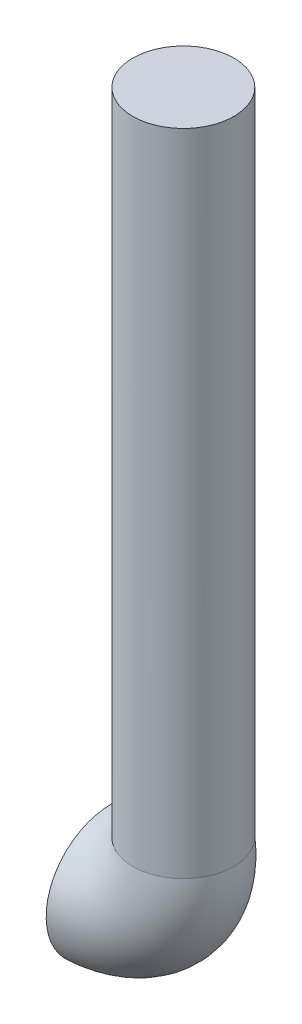
ISO-10303-21;
HEADER;
FILE_DESCRIPTION(('STEP AP214'),'2;1');
FILE_NAME('part.step','',(''),(''),'','','');
FILE_SCHEMA(('AUTOMOTIVE_DESIGN { 1 0 10303 214 1 1 1 1 }'));
ENDSEC;
DATA;
#1=APPLICATION_CONTEXT('core data for automotive mechanical design processes');
#2=APPLICATION_PROTOCOL_DEFINITION('international standard','automotive_design',2000,#1);
#3=PRODUCT_CONTEXT('',#1,'mechanical');
#4=PRODUCT('Part','Part','',(#3));
#5=PRODUCT_RELATED_PRODUCT_CATEGORY('part','',(#4));
#6=PRODUCT_DEFINITION_FORMATION('','',#4);
#7=PRODUCT_DEFINITION_CONTEXT('part definition',#1,'design');
#8=PRODUCT_DEFINITION('design','',#6,#7);
#9=PRODUCT_DEFINITION_SHAPE('','',#8);
#10=(LENGTH_UNIT() NAMED_UNIT(*) SI_UNIT(.MILLI.,.METRE.));
#11=(NAMED_UNIT(*) PLANE_ANGLE_UNIT() SI_UNIT($,.RADIAN.));
#12=(NAMED_UNIT(*) SI_UNIT($,.STERADIAN.) SOLID_ANGLE_UNIT());
#13=UNCERTAINTY_MEASURE_WITH_UNIT(LENGTH_MEASURE(1.E-05),#10,'distance_accuracy_value','');
#14=(GEOMETRIC_REPRESENTATION_CONTEXT(3) GLOBAL_UNCERTAINTY_ASSIGNED_CONTEXT((#13)) GLOBAL_UNIT_ASSIGNED_CONTEXT((#10,
#11,#12)) REPRESENTATION_CONTEXT('',''));
#15=CARTESIAN_POINT('',(0.,0.,0.));
#16=DIRECTION('',(0.,0.,1.));
#17=DIRECTION('',(1.,0.,0.));
#18=AXIS2_PLACEMENT_3D('',#15,#16,#17);
#19=CARTESIAN_POINT('',(0.,0.,0.));
#20=DIRECTION('',(1.,0.,0.));
#21=DIRECTION('',(0.,0.,-1.));
#22=AXIS2_PLACEMENT_3D('',#19,#20,#21);
#23=PLANE('',#22);
#24=CARTESIAN_POINT('',(0.,0.,0.));
#25=DIRECTION('',(1.,0.,0.));
#26=DIRECTION('',(0.,0.,-1.));
#27=AXIS2_PLACEMENT_3D('',#24,#25,#26);
#28=CIRCLE('',#27,45.);
#29=CARTESIAN_POINT('',(0.,45.,0.));
#30=VERTEX_POINT('',#29);
#31=EDGE_CURVE('E101',#30,#30,#28,.T.);
#32=ORIENTED_EDGE('',*,*,#31,.F.);
#33=EDGE_LOOP('',(#32));
#34=FACE_BOUND('',#33,.T.);
#35=ADVANCED_FACE('F90',(#34),#23,.F.);
#36=CARTESIAN_POINT('',(0.,45.,0.));
#37=CARTESIAN_POINT('',(0.901513033470843,45.,0.));
#38=CARTESIAN_POINT('',(2.69646026917308,45.0974751710836,0.));
#39=CARTESIAN_POINT('',(5.34267302579849,45.5287895732233,0.));
#40=CARTESIAN_POINT('',(7.9207060822864,46.2378817531408,0.));
#41=CARTESIAN_POINT('',(10.4085878354272,47.2174278430996,0.));
#42=CARTESIAN_POINT('',(12.7843466820114,48.460103975363,0.));
#43=CARTESIAN_POINT('',(14.2787895732233,49.4590921799175,0.));
#44=CARTESIAN_POINT('',(15.,50.,0.));
#45=CARTESIAN_POINT('',(0.,45.,2.94524308923763));
#46=CARTESIAN_POINT('',(0.901513033470843,45.,2.90888206344457));
#47=CARTESIAN_POINT('',(2.69646026917308,45.0974751710836,2.83616001185846));
#48=CARTESIAN_POINT('',(5.34267302579849,45.5287895732233,2.72707693447929));
#49=CARTESIAN_POINT('',(7.9207060822864,46.2378817531408,2.61799385710012));
#50=CARTESIAN_POINT('',(10.4085878354272,47.2174278430996,2.50891077972094));
#51=CARTESIAN_POINT('',(12.7843466820114,48.460103975363,2.39982770234177));
#52=CARTESIAN_POINT('',(14.2787895732233,49.4590921799175,2.32710565075566));
#53=CARTESIAN_POINT('',(15.,50.,2.2907446249626));
#54=CARTESIAN_POINT('',(0.,44.4200104384641,8.83565717394071));
#55=CARTESIAN_POINT('',(0.952511118999899,44.4131695807717,8.72657477374235));
#56=CARTESIAN_POINT('',(2.84757549678634,44.5142539917553,8.50840997334561));
#57=CARTESIAN_POINT('',(5.62794994656593,44.9978874592939,8.1811627727505));
#58=CARTESIAN_POINT('',(8.31559403298909,45.8032930443397,7.85391557215539));
#59=CARTESIAN_POINT('',(10.8735584952866,46.9130372326341,7.52666837156029));
#60=CARTESIAN_POINT('',(13.2716171619726,48.3036711142439,7.19942117096518));
#61=CARTESIAN_POINT('',(14.7478623045736,49.4071867447071,6.98125637056844));
#62=CARTESIAN_POINT('',(15.4510988092472,50.,6.87217397037007));
#63=CARTESIAN_POINT('',(0.,41.8426261251852,17.3318278131985));
#64=CARTESIAN_POINT('',(1.17087025321445,41.8178404723971,17.1178538283763));
#65=CARTESIAN_POINT('',(3.49490190491265,41.9543604837398,16.6899058587318));
#66=CARTESIAN_POINT('',(6.85266943317476,42.6846313247061,16.0479839042651));
#67=CARTESIAN_POINT('',(10.0164351123024,43.9181509345635,15.4060619497984));
#68=CARTESIAN_POINT('',(12.8874668440929,45.5957835071498,14.7641399953317));
#69=CARTESIAN_POINT('',(15.4014883629205,47.6275643334707,14.122218040865));
#70=CARTESIAN_POINT('',(16.8186518553156,49.1828030815787,13.6942700712205));
#71=CARTESIAN_POINT('',(17.4557379627214,50.0000000000001,13.4802960863983));
#72=CARTESIAN_POINT('',(0.,37.6573960979454,25.1618872951686));
#73=CARTESIAN_POINT('',(1.51706112721068,37.6160997869484,24.851246656357));
#74=CARTESIAN_POINT('',(4.52149571719272,37.8298283218147,24.2299653787337));
#75=CARTESIAN_POINT('',(8.79777827555814,38.9749326334403,23.2980434622987));
#76=CARTESIAN_POINT('',(12.7235485067686,40.9037496297321,22.3661215458637));
#77=CARTESIAN_POINT('',(16.1045917456784,43.4926945079496,21.4341996294287));
#78=CARTESIAN_POINT('',(18.8240088539006,46.5490054150949,20.5022777129937));
#79=CARTESIAN_POINT('',(20.1673178563978,48.8248061225318,19.8809964353703));
#80=CARTESIAN_POINT('',(20.7108982891452,49.9999999999999,19.5703557965587));
#81=CARTESIAN_POINT('',(0.,32.0249746957903,32.0250007786261));
#82=CARTESIAN_POINT('',(1.97442075968852,31.9743250599131,31.6296310290007));
#83=CARTESIAN_POINT('',(5.87807262559157,32.3119973261194,30.8388915297499));
#84=CARTESIAN_POINT('',(11.3710654330683,34.0299851805333,29.6527822808737));
#85=CARTESIAN_POINT('',(16.3110029418339,36.8946390223811,28.4666730319976));
#86=CARTESIAN_POINT('',(20.3801048118759,40.6989694651153,27.2805637831214));
#87=CARTESIAN_POINT('',(23.3933717165275,45.1171830576154,26.0944545342452));
#88=CARTESIAN_POINT('',(24.6598001467105,48.3495025309639,25.3037150349944));
#89=CARTESIAN_POINT('',(25.0917211489709,50.0000000000001,24.908345285369));
#90=CARTESIAN_POINT('',(0.,25.1618670379755,37.6574052650066));
#91=CARTESIAN_POINT('',(2.52385914835926,25.1116417858657,37.1924996623609));
#92=CARTESIAN_POINT('',(7.50806725910825,25.618749633635,36.2626884570696));
#93=CARTESIAN_POINT('',(14.4657577391254,28.0482166144947,34.8679716491326));
#94=CARTESIAN_POINT('',(20.6310239540471,32.0532943951502,33.4732548411956));
#95=CARTESIAN_POINT('',(25.5400534026541,37.3284245354637,32.0785380332586));
#96=CARTESIAN_POINT('',(28.9273647175859,43.3905944228975,30.6838212253216));
#97=CARTESIAN_POINT('',(30.1207792083368,47.7763017913935,29.7540100200302));
#98=CARTESIAN_POINT('',(30.4296615248549,49.9999999999998,29.2891044173846));
#99=CARTESIAN_POINT('',(0.,17.331794295561,41.8426661131929));
#100=CARTESIAN_POINT('',(3.14426164021047,17.2917683971965,41.3260900841274));
#101=CARTESIAN_POINT('',(9.34884029457072,18.0073140911799,40.2929380259965));
#102=CARTESIAN_POINT('',(17.9629341228076,21.2595319517045,38.7432099388001));
#103=CARTESIAN_POINT('',(25.5176152234435,26.5657990565824,37.1934818516038));
#104=CARTESIAN_POINT('',(31.3861890692977,33.5106145597484,35.6437537644074));
#105=CARTESIAN_POINT('',(35.213405863005,41.4356060147758,34.094025677211));
#106=CARTESIAN_POINT('',(36.3405164610571,47.1272365023302,33.0608736190801));
#107=CARTESIAN_POINT('',(36.5197306864273,50.0000000000001,32.5442975900146));
#108=CARTESIAN_POINT('',(0.,8.83567332881837,44.4199347146984));
#109=CARTESIAN_POINT('',(3.81289539387821,8.81355258832845,43.8715405671825));
#110=CARTESIAN_POINT('',(11.3328978437523,9.76591595324819,42.7747522721508));
#111=CARTESIAN_POINT('',(21.7339643830838,13.9186333346829,41.1295698296032));
#112=CARTESIAN_POINT('',(30.7902167348944,20.6368341598255,39.4843873870556));
#113=CARTESIAN_POINT('',(37.7008451028725,29.3874929417916,37.839204944508));
#114=CARTESIAN_POINT('',(42.0146403334409,39.3247836186185,36.1940225019604));
#115=CARTESIAN_POINT('',(43.0817641226755,46.4264056894601,35.0972342069286));
#116=CARTESIAN_POINT('',(43.1278125129903,50.,34.5488400594127));
#117=CARTESIAN_POINT('',(0.,0.,45.2901734618902));
#118=CARTESIAN_POINT('',(4.50592807445152,0.,44.7310354400207));
#119=CARTESIAN_POINT('',(13.3894475377855,1.20409630931862,43.6127593962815));
#120=CARTESIAN_POINT('',(25.6436213576409,6.29727557393797,41.9353453306728));
#121=CARTESIAN_POINT('',(36.2583730313484,14.4838703590184,40.2579312650641));
#122=CARTESIAN_POINT('',(44.2531608718807,25.1095394194104,38.5805171994553));
#123=CARTESIAN_POINT('',(49.0777209063449,37.1349561867916,36.9031031338466));
#124=CARTESIAN_POINT('',(50.0885830206972,45.6993294341362,35.7848270901074));
#125=CARTESIAN_POINT('',(50.,49.9999999999999,35.2256890682378));
#126=CARTESIAN_POINT('',(0.,-8.83567332881827,44.4199347146983));
#127=CARTESIAN_POINT('',(5.19896075502482,-8.81355258832836,43.8715405671824));
#128=CARTESIAN_POINT('',(15.4459972318186,-7.35772333461084,42.7747522721507));
#129=CARTESIAN_POINT('',(29.5532783321979,-1.32408218680681,41.1295698296031));
#130=CARTESIAN_POINT('',(41.7265293278024,8.33090655821138,39.4843873870555));
#131=CARTESIAN_POINT('',(50.8054766408889,20.8315858970294,37.8392049445079));
#132=CARTESIAN_POINT('',(56.1408014792489,34.9451287549649,36.1940225019603));
#133=CARTESIAN_POINT('',(57.0954019187188,44.9722531788126,35.0972342069286));
#134=CARTESIAN_POINT('',(56.8721874870097,50.0000000000001,34.5488400594127));
#135=CARTESIAN_POINT('',(0.,-17.331794295561,41.8426661131932));
#136=CARTESIAN_POINT('',(5.86759450869256,-17.2917683971965,41.3260900841278));
#137=CARTESIAN_POINT('',(17.4300547810002,-15.5991214725426,40.2929380259968));
#138=CARTESIAN_POINT('',(33.3243085924741,-8.66498080382846,38.7432099388004));
#139=CARTESIAN_POINT('',(46.9991308392533,2.40194166145439,37.1934818516039));
#140=CARTESIAN_POINT('',(57.1201326744638,16.7084642790725,35.6437537644075));
#141=CARTESIAN_POINT('',(62.9420359496849,32.8343063588074,34.0940256772111));
#142=CARTESIAN_POINT('',(63.8366495803372,44.2714223659423,33.0608736190801));
#143=CARTESIAN_POINT('',(63.4802693135727,49.9999999999999,32.5442975900147));
#144=CARTESIAN_POINT('',(0.,-25.1618670379754,37.6574052650064));
#145=CARTESIAN_POINT('',(6.48799700054377,-25.1116417858657,37.1924996623608));
#146=CARTESIAN_POINT('',(19.2708278164627,-23.2105570149977,36.2626884570694));
#147=CARTESIAN_POINT('',(36.8214849761563,-15.4536654666187,34.8679716491325));
#148=CARTESIAN_POINT('',(51.8857221086497,-3.0855536771134,33.4732548411955));
#149=CARTESIAN_POINT('',(62.9662683411073,12.8906543033571,32.0785380332585));
#150=CARTESIAN_POINT('',(69.228077095104,30.8793179506857,30.6838212253215));
#151=CARTESIAN_POINT('',(70.0563868330575,43.6223570768789,29.7540100200302));
#152=CARTESIAN_POINT('',(69.5703384751451,50.0000000000001,29.2891044173846));
#153=CARTESIAN_POINT('',(0.,-32.0249746957904,32.0250007786262));
#154=CARTESIAN_POINT('',(7.03743538921451,-31.9743250599131,31.6296310290008));
#155=CARTESIAN_POINT('',(20.9008224499793,-29.9038047074822,30.83889152975));
#156=CARTESIAN_POINT('',(39.9161772822135,-21.4354340326573,29.6527822808738));
#157=CARTESIAN_POINT('',(56.2057431208629,-7.92689830434424,28.4666730319976));
#158=CARTESIAN_POINT('',(68.1262169318856,9.52010937370563,27.2805637831214));
#159=CARTESIAN_POINT('',(74.7620700961623,29.1527293159679,26.0944545342452));
#160=CARTESIAN_POINT('',(75.5173658946838,43.0491563373087,25.3037150349944));
#161=CARTESIAN_POINT('',(74.9082788510292,50.,24.908345285369));
#162=CARTESIAN_POINT('',(0.,-37.6573960979453,25.1618872951686));
#163=CARTESIAN_POINT('',(7.49479502169234,-37.6160997869483,24.8512466563569));
#164=CARTESIAN_POINT('',(22.2573993583781,-35.4216357031773,24.2299653787336));
#165=CARTESIAN_POINT('',(42.4894644397235,-26.3803814855642,23.2980434622987));
#166=CARTESIAN_POINT('',(59.7931975559281,-11.9360089116952,22.3661215458637));
#167=CARTESIAN_POINT('',(72.4017299980829,6.72638433087124,21.4341996294287));
#168=CARTESIAN_POINT('',(79.3314329587891,27.7209069584884,20.5022777129937));
#169=CARTESIAN_POINT('',(80.0098481849963,42.5738527457408,19.8809964353704));
#170=CARTESIAN_POINT('',(79.2891017108547,50.0000000000001,19.5703557965588));
#171=CARTESIAN_POINT('',(0.,-41.8426261251852,17.3318278131987));
#172=CARTESIAN_POINT('',(7.84098589568859,-41.8178404723972,17.1178538283764));
#173=CARTESIAN_POINT('',(23.2839931706583,-39.5461678651026,16.6899058587319));
#174=CARTESIAN_POINT('',(44.434573282107,-30.0900801768302,16.0479839042652));
#175=CARTESIAN_POINT('',(62.5003109503945,-14.9504102165267,15.4060619497985));
#176=CARTESIAN_POINT('',(75.6188548996686,4.62329533167102,14.7641399953317));
#177=CARTESIAN_POINT('',(82.7539534497695,26.6423480401126,14.122218040865));
#178=CARTESIAN_POINT('',(83.3585141860789,42.2158557866939,13.6942700712205));
#179=CARTESIAN_POINT('',(82.5442620372789,49.9999999999999,13.4802960863983));
#180=CARTESIAN_POINT('',(0.,-44.4200104384641,8.83565717394064));
#181=CARTESIAN_POINT('',(8.05934502990312,-44.4131695807717,8.72657477374227));
#182=CARTESIAN_POINT('',(23.9313195787845,-42.106061373118,8.50840997334555));
#183=CARTESIAN_POINT('',(45.6592927687157,-32.4033363114179,8.18116277275046));
#184=CARTESIAN_POINT('',(64.2011520297076,-16.8355523263028,7.85391557215538));
#185=CARTESIAN_POINT('',(77.6327632484746,3.3060416061868,7.52666837156029));
#186=CARTESIAN_POINT('',(84.8838246507171,25.9662412593394,7.19942117096521));
#187=CARTESIAN_POINT('',(85.4293037368206,41.9914721235656,6.98125637056848));
#188=CARTESIAN_POINT('',(84.5489011907527,50.0000000000001,6.87217397037012));
#189=CARTESIAN_POINT('',(0.,-45.,2.94524308923764));
#190=CARTESIAN_POINT('',(8.11034311543219,-45.,2.90888206344457));
#191=CARTESIAN_POINT('',(24.0824348063978,-42.6892825524463,2.83616001185846));
#192=CARTESIAN_POINT('',(45.9445696894832,-32.9342384253473,2.72707693447929));
#193=CARTESIAN_POINT('',(64.5960399804104,-17.270141035104,2.61799385710012));
#194=CARTESIAN_POINT('',(78.0977339083341,3.0016509957213,2.50891077972094));
#195=CARTESIAN_POINT('',(85.3710951306785,25.8098083982203,2.39982770234177));
#196=CARTESIAN_POINT('',(85.898376468171,41.9395666883551,2.32710565075566));
#197=CARTESIAN_POINT('',(85.,50.,2.2907446249626));
#198=CARTESIAN_POINT('',(0.,-45.,-2.94524308923762));
#199=CARTESIAN_POINT('',(8.11034311543219,-45.,-2.90888206344457));
#200=CARTESIAN_POINT('',(24.0824348063978,-42.6892825524463,-2.83616001185846));
#201=CARTESIAN_POINT('',(45.9445696894832,-32.9342384253473,-2.72707693447929));
#202=CARTESIAN_POINT('',(64.5960399804104,-17.270141035104,-2.61799385710012));
#203=CARTESIAN_POINT('',(78.0977339083341,3.0016509957213,-2.50891077972094));
#204=CARTESIAN_POINT('',(85.3710951306785,25.8098083982203,-2.39982770234177));
#205=CARTESIAN_POINT('',(85.898376468171,41.9395666883551,-2.32710565075566));
#206=CARTESIAN_POINT('',(85.,50.,-2.2907446249626));
#207=CARTESIAN_POINT('',(0.,-44.4200104384641,-8.83565717394064));
#208=CARTESIAN_POINT('',(8.05934502990312,-44.4131695807716,-8.72657477374227));
#209=CARTESIAN_POINT('',(23.9313195787845,-42.106061373118,-8.50840997334554));
#210=CARTESIAN_POINT('',(45.6592927687157,-32.4033363114179,-8.18116277275044));
#211=CARTESIAN_POINT('',(64.2011520297076,-16.8355523263029,-7.85391557215534));
#212=CARTESIAN_POINT('',(77.6327632484746,3.30604160618671,-7.52666837156023));
#213=CARTESIAN_POINT('',(84.8838246507171,25.9662412593393,-7.19942117096513));
#214=CARTESIAN_POINT('',(85.4293037368205,41.9914721235654,-6.9812563705684));
#215=CARTESIAN_POINT('',(84.5489011907526,49.9999999999999,-6.87217397037003));
#216=CARTESIAN_POINT('',(0.,-41.8426261251853,-17.3318278131986));
#217=CARTESIAN_POINT('',(7.8409858956886,-41.8178404723973,-17.1178538283763));
#218=CARTESIAN_POINT('',(23.2839931706583,-39.5461678651027,-16.6899058587319));
#219=CARTESIAN_POINT('',(44.4345732821071,-30.0900801768301,-16.0479839042652));
#220=CARTESIAN_POINT('',(62.5003109503945,-14.9504102165266,-15.4060619497985));
#221=CARTESIAN_POINT('',(75.6188548996687,4.6232953316712,-14.7641399953318));
#222=CARTESIAN_POINT('',(82.7539534497697,26.6423480401129,-14.1222180408651));
#223=CARTESIAN_POINT('',(83.3585141860791,42.2158557866942,-13.6942700712206));
#224=CARTESIAN_POINT('',(82.5442620372791,50.0000000000002,-13.4802960863984));
#225=CARTESIAN_POINT('',(0.,-37.6573960979452,-25.1618872951685));
#226=CARTESIAN_POINT('',(7.49479502169233,-37.6160997869483,-24.8512466563569));
#227=CARTESIAN_POINT('',(22.2573993583781,-35.4216357031773,-24.2299653787336));
#228=CARTESIAN_POINT('',(42.4894644397234,-26.3803814855643,-23.2980434622986));
#229=CARTESIAN_POINT('',(59.793197555928,-11.9360089116953,-22.3661215458636));
#230=CARTESIAN_POINT('',(72.4017299980827,6.72638433087111,-21.4341996294286));
#231=CARTESIAN_POINT('',(79.3314329587889,27.7209069584882,-20.5022777129936));
#232=CARTESIAN_POINT('',(80.0098481849961,42.5738527457406,-19.8809964353703));
#233=CARTESIAN_POINT('',(79.2891017108545,49.9999999999999,-19.5703557965586));
#234=CARTESIAN_POINT('',(0.,-32.0249746957904,-32.0250007786261));
#235=CARTESIAN_POINT('',(7.03743538921452,-31.9743250599132,-31.6296310290008));
#236=CARTESIAN_POINT('',(20.9008224499794,-29.9038047074822,-30.83889152975));
#237=CARTESIAN_POINT('',(39.9161772822135,-21.4354340326573,-29.6527822808738));
#238=CARTESIAN_POINT('',(56.205743120863,-7.92689830434416,-28.4666730319976));
#239=CARTESIAN_POINT('',(68.1262169318857,9.52010937370577,-27.2805637831215));
#240=CARTESIAN_POINT('',(74.7620700961625,29.1527293159681,-26.0944545342453));
#241=CARTESIAN_POINT('',(75.517365894684,43.049156337309,-25.3037150349945));
#242=CARTESIAN_POINT('',(74.9082788510294,50.0000000000002,-24.9083452853691));
#243=CARTESIAN_POINT('',(0.,-25.1618670379755,-37.6574052650065));
#244=CARTESIAN_POINT('',(6.48799700054377,-25.1116417858657,-37.1924996623608));
#245=CARTESIAN_POINT('',(19.2708278164626,-23.2105570149978,-36.2626884570695));
#246=CARTESIAN_POINT('',(36.8214849761563,-15.4536654666188,-34.8679716491325));
#247=CARTESIAN_POINT('',(51.8857221086496,-3.08555367711354,-33.4732548411955));
#248=CARTESIAN_POINT('',(62.9662683411071,12.8906543033569,-32.0785380332585));
#249=CARTESIAN_POINT('',(69.2280770951038,30.8793179506855,-30.6838212253215));
#250=CARTESIAN_POINT('',(70.0563868330573,43.6223570768787,-29.7540100200301));
#251=CARTESIAN_POINT('',(69.5703384751449,49.9999999999998,-29.2891044173845));
#252=CARTESIAN_POINT('',(0.,-17.3317942955611,-41.8426661131929));
#253=CARTESIAN_POINT('',(5.86759450869256,-17.2917683971966,-41.3260900841275));
#254=CARTESIAN_POINT('',(17.4300547810002,-15.5991214725426,-40.2929380259966));
#255=CARTESIAN_POINT('',(33.3243085924741,-8.66498080382848,-38.7432099388002));
#256=CARTESIAN_POINT('',(46.9991308392534,2.40194166145443,-37.1934818516038));
#257=CARTESIAN_POINT('',(57.1201326744638,16.7084642790726,-35.6437537644075));
#258=CARTESIAN_POINT('',(62.9420359496849,32.8343063588076,-34.0940256772111));
#259=CARTESIAN_POINT('',(63.8366495803373,44.2714223659425,-33.0608736190802));
#260=CARTESIAN_POINT('',(63.4802693135728,50.,-32.5442975900147));
#261=CARTESIAN_POINT('',(0.,-8.83567332881837,-44.4199347146984));
#262=CARTESIAN_POINT('',(5.19896075502482,-8.81355258832845,-43.8715405671825));
#263=CARTESIAN_POINT('',(15.4459972318186,-7.35772333461094,-42.7747522721508));
#264=CARTESIAN_POINT('',(29.5532783321979,-1.32408218680691,-41.1295698296032));
#265=CARTESIAN_POINT('',(41.7265293278024,8.33090655821128,-39.4843873870555));
#266=CARTESIAN_POINT('',(50.8054766408889,20.8315858970293,-37.8392049445079));
#267=CARTESIAN_POINT('',(56.1408014792489,34.9451287549648,-36.1940225019603));
#268=CARTESIAN_POINT('',(57.0954019187188,44.9722531788124,-35.0972342069285));
#269=CARTESIAN_POINT('',(56.8721874870097,50.,-34.5488400594126));
#270=CARTESIAN_POINT('',(0.,-1.22298005056365E-13,-45.2901734618903));
#271=CARTESIAN_POINT('',(4.50592807445152,-1.25767452008319E-13,-44.7310354400207));
#272=CARTESIAN_POINT('',(13.3894475377854,1.2040963093185,-43.6127593962815));
#273=CARTESIAN_POINT('',(25.6436213576409,6.29727557393785,-41.9353453306728));
#274=CARTESIAN_POINT('',(36.2583730313484,14.4838703590183,-40.2579312650641));
#275=CARTESIAN_POINT('',(44.2531608718807,25.1095394194103,-38.5805171994554));
#276=CARTESIAN_POINT('',(49.0777209063449,37.1349561867915,-36.9031031338466));
#277=CARTESIAN_POINT('',(50.0885830206972,45.6993294341361,-35.7848270901075));
#278=CARTESIAN_POINT('',(50.,49.9999999999998,-35.2256890682379));
#279=CARTESIAN_POINT('',(0.,8.83567332881834,-44.4199347146983));
#280=CARTESIAN_POINT('',(3.81289539387821,8.81355258832845,-43.8715405671824));
#281=CARTESIAN_POINT('',(11.3328978437523,9.76591595324821,-42.7747522721507));
#282=CARTESIAN_POINT('',(21.7339643830838,13.918633334683,-41.1295698296031));
#283=CARTESIAN_POINT('',(30.7902167348944,20.6368341598256,-39.4843873870555));
#284=CARTESIAN_POINT('',(37.7008451028725,29.3874929417917,-37.8392049445079));
#285=CARTESIAN_POINT('',(42.0146403334409,39.3247836186187,-36.1940225019603));
#286=CARTESIAN_POINT('',(43.0817641226755,46.4264056894604,-35.0972342069286));
#287=CARTESIAN_POINT('',(43.1278125129902,50.0000000000002,-34.5488400594127));
#288=CARTESIAN_POINT('',(0.,17.3317942955608,-41.8426661131931));
#289=CARTESIAN_POINT('',(3.14426164021047,17.2917683971963,-41.3260900841276));
#290=CARTESIAN_POINT('',(9.34884029457072,18.0073140911797,-40.2929380259967));
#291=CARTESIAN_POINT('',(17.9629341228076,21.2595319517042,-38.7432099388003));
#292=CARTESIAN_POINT('',(25.5176152234435,26.5657990565822,-37.1934818516039));
#293=CARTESIAN_POINT('',(31.3861890692976,33.5106145597481,-35.6437537644075));
#294=CARTESIAN_POINT('',(35.213405863005,41.4356060147756,-34.094025677211));
#295=CARTESIAN_POINT('',(36.3405164610571,47.1272365023301,-33.0608736190801));
#296=CARTESIAN_POINT('',(36.5197306864273,49.9999999999999,-32.5442975900146));
#297=CARTESIAN_POINT('',(0.,25.1618670379755,-37.6574052650066));
#298=CARTESIAN_POINT('',(2.52385914835926,25.1116417858657,-37.1924996623609));
#299=CARTESIAN_POINT('',(7.50806725910826,25.6187496336351,-36.2626884570696));
#300=CARTESIAN_POINT('',(14.4657577391254,28.0482166144947,-34.8679716491326));
#301=CARTESIAN_POINT('',(20.6310239540472,32.0532943951503,-33.4732548411956));
#302=CARTESIAN_POINT('',(25.5400534026542,37.3284245354638,-32.0785380332586));
#303=CARTESIAN_POINT('',(28.927364717586,43.3905944228976,-30.6838212253215));
#304=CARTESIAN_POINT('',(30.1207792083369,47.7763017913937,-29.7540100200302));
#305=CARTESIAN_POINT('',(30.429661524855,50.,-29.2891044173845));
#306=CARTESIAN_POINT('',(0.,32.0249746957902,-32.025000778626));
#307=CARTESIAN_POINT('',(1.97442075968852,31.974325059913,-31.6296310290007));
#308=CARTESIAN_POINT('',(5.87807262559156,32.3119973261193,-30.8388915297499));
#309=CARTESIAN_POINT('',(11.3710654330682,34.0299851805332,-29.6527822808737));
#310=CARTESIAN_POINT('',(16.3110029418339,36.894639022381,-28.4666730319976));
#311=CARTESIAN_POINT('',(20.3801048118758,40.6989694651152,-27.2805637831214));
#312=CARTESIAN_POINT('',(23.3933717165275,45.1171830576153,-26.0944545342452));
#313=CARTESIAN_POINT('',(24.6598001467105,48.3495025309638,-25.3037150349945));
#314=CARTESIAN_POINT('',(25.0917211489708,50.,-24.9083452853691));
#315=CARTESIAN_POINT('',(0.,37.6573960979454,-25.1618872951687));
#316=CARTESIAN_POINT('',(1.51706112721068,37.6160997869484,-24.851246656357));
#317=CARTESIAN_POINT('',(4.52149571719273,37.8298283218147,-24.2299653787337));
#318=CARTESIAN_POINT('',(8.79777827555816,38.9749326334403,-23.2980434622987));
#319=CARTESIAN_POINT('',(12.7235485067686,40.9037496297321,-22.3661215458637));
#320=CARTESIAN_POINT('',(16.1045917456784,43.4926945079497,-21.4341996294287));
#321=CARTESIAN_POINT('',(18.8240088539007,46.549005415095,-20.5022777129937));
#322=CARTESIAN_POINT('',(20.1673178563979,48.8248061225319,-19.8809964353704));
#323=CARTESIAN_POINT('',(20.7108982891452,50.,-19.5703557965587));
#324=CARTESIAN_POINT('',(0.,41.8426261251851,-17.3318278131986));
#325=CARTESIAN_POINT('',(1.17087025321445,41.8178404723971,-17.1178538283763));
#326=CARTESIAN_POINT('',(3.49490190491265,41.9543604837398,-16.6899058587319));
#327=CARTESIAN_POINT('',(6.85266943317475,42.684631324706,-16.0479839042651));
#328=CARTESIAN_POINT('',(10.0164351123024,43.9181509345634,-15.4060619497984));
#329=CARTESIAN_POINT('',(12.8874668440929,45.5957835071497,-14.7641399953317));
#330=CARTESIAN_POINT('',(15.4014883629205,47.6275643334705,-14.122218040865));
#331=CARTESIAN_POINT('',(16.8186518553156,49.1828030815784,-13.6942700712205));
#332=CARTESIAN_POINT('',(17.4557379627213,49.9999999999999,-13.4802960863983));
#333=CARTESIAN_POINT('',(0.,44.4200104384642,-8.83565717394071));
#334=CARTESIAN_POINT('',(0.9525111189999,44.4131695807717,-8.72657477374234));
#335=CARTESIAN_POINT('',(2.84757549678635,44.5142539917554,-8.5084099733456));
#336=CARTESIAN_POINT('',(5.62794994656593,44.997887459294,-8.1811627727505));
#337=CARTESIAN_POINT('',(8.3155940329891,45.8032930443398,-7.8539155721554));
#338=CARTESIAN_POINT('',(10.8735584952866,46.9130372326342,-7.5266683715603));
#339=CARTESIAN_POINT('',(13.2716171619726,48.303671114244,-7.1994211709652));
#340=CARTESIAN_POINT('',(14.7478623045736,49.4071867447072,-6.98125637056847));
#341=CARTESIAN_POINT('',(15.4510988092472,50.0000000000001,-6.87217397037011));
#342=CARTESIAN_POINT('',(0.,45.,-2.94524308923763));
#343=CARTESIAN_POINT('',(0.901513033470843,45.,-2.90888206344457));
#344=CARTESIAN_POINT('',(2.69646026917308,45.0974751710836,-2.83616001185846));
#345=CARTESIAN_POINT('',(5.34267302579849,45.5287895732233,-2.72707693447929));
#346=CARTESIAN_POINT('',(7.9207060822864,46.2378817531408,-2.61799385710012));
#347=CARTESIAN_POINT('',(10.4085878354272,47.2174278430996,-2.50891077972094));
#348=CARTESIAN_POINT('',(12.7843466820114,48.460103975363,-2.39982770234177));
#349=CARTESIAN_POINT('',(14.2787895732233,49.4590921799175,-2.32710565075566));
#350=CARTESIAN_POINT('',(15.,50.,-2.29074462496261));
#351=CARTESIAN_POINT('',(0.,45.,0.));
#352=CARTESIAN_POINT('',(0.901513033470843,45.,0.));
#353=CARTESIAN_POINT('',(2.69646026917308,45.0974751710836,0.));
#354=CARTESIAN_POINT('',(5.34267302579849,45.5287895732233,0.));
#355=CARTESIAN_POINT('',(7.9207060822864,46.2378817531408,0.));
#356=CARTESIAN_POINT('',(10.4085878354272,47.2174278430996,0.));
#357=CARTESIAN_POINT('',(12.7843466820114,48.460103975363,0.));
#358=CARTESIAN_POINT('',(14.2787895732233,49.4590921799175,0.));
#359=CARTESIAN_POINT('',(15.,50.,0.));
#360=B_SPLINE_SURFACE_WITH_KNOTS('',3,3,((#36,#37,#38,#39,#40,#41,#42,#43,#44),(#45,#46,#47,#48,
#49,#50,#51,#52,#53),(#54,#55,#56,#57,#58,#59,#60,#61,#62),(#63,#64,#65,#66,#67,#68,#69,#70,
#71),(#72,#73,#74,#75,#76,#77,#78,#79,#80),(#81,#82,#83,#84,#85,#86,#87,#88,#89),(#90,#91,#92,
#93,#94,#95,#96,#97,#98),(#99,#100,#101,#102,#103,#104,#105,#106,#107),(#108,#109,#110,#111,
#112,#113,#114,#115,#116),(#117,#118,#119,#120,#121,#122,#123,#124,#125),(#126,#127,#128,#129,
#130,#131,#132,#133,#134),(#135,#136,#137,#138,#139,#140,#141,#142,#143),(#144,#145,#146,#147,
#148,#149,#150,#151,#152),(#153,#154,#155,#156,#157,#158,#159,#160,#161),(#162,#163,#164,#165,
#166,#167,#168,#169,#170),(#171,#172,#173,#174,#175,#176,#177,#178,#179),(#180,#181,#182,#183,
#184,#185,#186,#187,#188),(#189,#190,#191,#192,#193,#194,#195,#196,#197),(#198,#199,#200,#201,
#202,#203,#204,#205,#206),(#207,#208,#209,#210,#211,#212,#213,#214,#215),(#216,#217,#218,#219,
#220,#221,#222,#223,#224),(#225,#226,#227,#228,#229,#230,#231,#232,#233),(#234,#235,#236,#237,
#238,#239,#240,#241,#242),(#243,#244,#245,#246,#247,#248,#249,#250,#251),(#252,#253,#254,#255,
#256,#257,#258,#259,#260),(#261,#262,#263,#264,#265,#266,#267,#268,#269),(#270,#271,#272,#273,
#274,#275,#276,#277,#278),(#279,#280,#281,#282,#283,#284,#285,#286,#287),(#288,#289,#290,#291,
#292,#293,#294,#295,#296),(#297,#298,#299,#300,#301,#302,#303,#304,#305),(#306,#307,#308,#309,
#310,#311,#312,#313,#314),(#315,#316,#317,#318,#319,#320,#321,#322,#323),(#324,#325,#326,#327,
#328,#329,#330,#331,#332),(#333,#334,#335,#336,#337,#338,#339,#340,#341),(#342,#343,#344,#345,
#346,#347,#348,#349,#350),(#351,#352,#353,#354,#355,#356,#357,#358,#359)),.UNSPECIFIED.,.T.,.F.,
.F.,(4,1,1,1,1,1,1,1,1,1,1,1,1,1,1,1,2,1,1,1,1,1,1,1,1,1,1,1,1,1,1,1,4),(4,1,1,1,1,1,4),(0.,
0.03125,0.0625,0.09375,0.125,0.15625,0.1875,0.21875,0.25,0.28125,0.3125,0.34375,0.375,0.40625,
0.4375,0.46875,0.5,0.53125,0.5625,0.59375,0.625,0.65625,0.6875,0.71875,0.75,0.78125,0.8125,
0.84375,0.875,0.90625,0.9375,0.96875,1.),(0.,0.166666666666667,0.333333333333333,0.5,
0.666666666666667,0.833333333333333,1.),.UNSPECIFIED.);
#361=CARTESIAN_POINT('',(50.,50.,0.));
#362=DIRECTION('',(0.,1.,0.));
#363=DIRECTION('',(0.,0.,1.));
#364=AXIS2_PLACEMENT_3D('',#361,#362,#363);
#365=CIRCLE('',#364,35.);
#366=CARTESIAN_POINT('',(15.,50.,0.));
#367=VERTEX_POINT('',#366);
#368=EDGE_CURVE('E12',#367,#367,#365,.T.);
#369=CARTESIAN_POINT('',(0.,45.,0.));
#370=CARTESIAN_POINT('',(0.0422496028451306,44.9999999987907,0.));
#371=CARTESIAN_POINT('',(0.0844992057575052,45.0001070446787,0.));
#372=CARTESIAN_POINT('',(0.168979905237994,45.0005351521215,0.));
#373=CARTESIAN_POINT('',(0.211211002253424,45.0008561254092,0.));
#374=CARTESIAN_POINT('',(0.295653935218484,45.0017118359282,0.));
#375=CARTESIAN_POINT('',(0.33786577204544,45.0022464865834,0.));
#376=CARTESIAN_POINT('',(0.422269429868378,45.0035292983214,0.));
#377=CARTESIAN_POINT('',(0.464461252154657,45.0042773745083,0.));
#378=CARTESIAN_POINT('',(0.548824126164404,45.0059867842884,0.));
#379=CARTESIAN_POINT('',(0.590995179574267,45.0069480346545,0.));
#380=CARTESIAN_POINT('',(0.675315761111817,45.0090835396533,0.));
#381=CARTESIAN_POINT('',(0.717465291305329,45.0102577127169,0.));
#382=CARTESIAN_POINT('',(0.801742071708622,45.0128188100167,0.));
#383=CARTESIAN_POINT('',(0.843869324347182,45.0142056543306,0.));
#384=CARTESIAN_POINT('',(0.928100794955148,45.0171918410392,0.));
#385=CARTESIAN_POINT('',(0.970205015700002,45.0187911051471,0.));
#386=CARTESIAN_POINT('',(1.05438966785147,45.0222018783657,0.));
#387=CARTESIAN_POINT('',(1.09647010236411,45.024013310814,0.));
#388=CARTESIAN_POINT('',(1.18060642739811,45.0278481676457,0.));
#389=CARTESIAN_POINT('',(1.22266232134014,45.0298715169802,0.));
#390=CARTESIAN_POINT('',(1.30674881059579,45.0341299545279,0.));
#391=CARTESIAN_POINT('',(1.348779409629,45.0363649692947,0.));
#392=CARTESIAN_POINT('',(1.43281455444557,45.0410464846615,0.));
#393=CARTESIAN_POINT('',(1.47481910423188,45.0434929134069,0.));
#394=CARTESIAN_POINT('',(1.55880139594873,45.048597003696,0.));
#395=CARTESIAN_POINT('',(1.6007791421502,45.0512545949663,0.));
#396=CARTESIAN_POINT('',(1.68470707210683,45.0567807572812,0.));
#397=CARTESIAN_POINT('',(1.72665726038567,45.0596492596229,0.));
#398=CARTESIAN_POINT('',(1.81052931992166,45.0655969910673,0.));
#399=CARTESIAN_POINT('',(1.85245119594021,45.068676153027,0.));
#400=CARTESIAN_POINT('',(1.93626587639528,45.0750449507046,0.));
#401=CARTESIAN_POINT('',(1.97815868581603,45.0783345208291,0.));
#402=CARTESIAN_POINT('',(2.06191447852998,45.085123881844,0.));
#403=CARTESIAN_POINT('',(2.10377746701553,45.0886236086802,0.));
#404=CARTESIAN_POINT('',(2.18747286332828,45.0958330301365,0.));
#405=CARTESIAN_POINT('',(2.22930527654135,45.0995426622314,0.));
#406=CARTESIAN_POINT('',(2.3129387677929,45.1071716412336,0.));
#407=CARTESIAN_POINT('',(2.35473985139637,45.1110909271343,0.));
#408=CARTESIAN_POINT('',(2.43830992892682,45.119138960787,0.));
#409=CARTESIAN_POINT('',(2.48007892858365,45.1232676490409,0.));
#410=CARTESIAN_POINT('',(2.5635840837332,45.1317342344487,0.));
#411=CARTESIAN_POINT('',(2.60532024510648,45.1360720736033,0.));
#412=CARTESIAN_POINT('',(2.6887589692154,45.1449567078713,0.));
#413=CARTESIAN_POINT('',(2.73046153796834,45.1495034464741,0.));
#414=CARTESIAN_POINT('',(2.813832322377,45.1588056267074,0.));
#415=CARTESIAN_POINT('',(2.85550054417291,45.1635610133063,0.));
#416=CARTESIAN_POINT('',(2.93880188022173,45.1732802366101,0.));
#417=CARTESIAN_POINT('',(2.98043500072403,45.178244019753,0.));
#418=CARTESIAN_POINT('',(3.06366537975354,45.1883797832329,0.));
#419=CARTESIAN_POINT('',(3.10526264462574,45.1935517114679,0.));
#420=CARTESIAN_POINT('',(3.18842055797654,45.2041035122296,0.));
#421=CARTESIAN_POINT('',(3.22998121288225,45.2094833341049,0.));
#422=CARTESIAN_POINT('',(3.31306515189498,45.2204506692543,0.));
#423=CARTESIAN_POINT('',(3.35458844249791,45.2260381333183,0.));
#424=CARTESIAN_POINT('',(3.43759689851332,45.2374204999616,0.));
#425=CARTESIAN_POINT('',(3.47908207047726,45.2432153547628,0.));
#426=CARTESIAN_POINT('',(3.56201353483612,45.2550122500061,0.));
#427=CARTESIAN_POINT('',(3.60345983382496,45.2610142440934,0.));
#428=CARTESIAN_POINT('',(3.68631279786812,45.2732251650433,0.));
#429=CARTESIAN_POINT('',(3.72771946954582,45.2794340469653,0.));
#430=CARTESIAN_POINT('',(3.81049242461418,45.2920584907285,0.));
#431=CARTESIAN_POINT('',(3.85185871464479,45.2984740090344,0.));
#432=CARTESIAN_POINT('',(3.9345501520793,45.3115114727178,0.));
#433=CARTESIAN_POINT('',(3.97587530612693,45.3181333759568,0.));
#434=CARTESIAN_POINT('',(4.0584837172686,45.3315833566674,0.));
#435=CARTESIAN_POINT('',(4.09976698099743,45.3384113933888,0.));
#436=CARTESIAN_POINT('',(4.1822908571873,45.3522733882339,0.));
#437=CARTESIAN_POINT('',(4.2235314762616,45.3593073069873,0.));
#438=CARTESIAN_POINT('',(4.30596930884077,45.3735808130744,0.));
#439=CARTESIAN_POINT('',(4.34716652892483,45.3808203624095,0.));
#440=CARTESIAN_POINT('',(4.42951680923442,45.3955048768462,0.));
#441=CARTESIAN_POINT('',(4.47066987599264,45.4029498053128,0.));
#442=CARTESIAN_POINT('',(4.55293109537382,45.4180448252071,0.));
#443=CARTESIAN_POINT('',(4.59403925447062,45.4256948813552,0.));
#444=CARTESIAN_POINT('',(4.67620990426457,45.4411999038152,0.));
#445=CARTESIAN_POINT('',(4.71727240136443,45.449054836195,0.));
#446=CARTESIAN_POINT('',(4.79935097291238,45.4649693583288,0.));
#447=CARTESIAN_POINT('',(4.84036705367984,45.4730289154908,0.));
#448=CARTESIAN_POINT('',(4.92235203832303,45.489352434407,0.));
#449=CARTESIAN_POINT('',(4.96332094842266,45.4976163649016,0.));
#450=CARTESIAN_POINT('',(5.04521083750236,45.5143483777088,0.));
#451=CARTESIAN_POINT('',(5.08613182259877,45.5228164300868,0.));
#452=CARTESIAN_POINT('',(5.16792510745626,45.5399564338939,0.));
#453=CARTESIAN_POINT('',(5.2087974132141,45.5486283567061,0.));
#454=CARTESIAN_POINT('',(5.29049258519069,45.5661758486221,0.));
#455=CARTESIAN_POINT('',(5.33131545727464,45.5750513904196,0.));
#456=CARTESIAN_POINT('',(5.41291100771163,45.5930058675539,0.));
#457=CARTESIAN_POINT('',(5.45368369178641,45.6020847768879,0.));
#458=CARTESIAN_POINT('',(5.53517811202512,45.6204457363499,0.));
#459=CARTESIAN_POINT('',(5.57589985375545,45.6297277617717,0.));
#460=CARTESIAN_POINT('',(5.6572916351372,45.6484947006711,0.));
#461=CARTESIAN_POINT('',(5.69796168018786,45.6579795907323,0.));
#462=CARTESIAN_POINT('',(5.77924931405396,45.677152006179,0.));
#463=CARTESIAN_POINT('',(5.81986690808971,45.6868395094314,0.));
#464=CARTESIAN_POINT('',(5.9010488857815,45.7064168985354,0.));
#465=CARTESIAN_POINT('',(5.94161327446712,45.7163067635308,0.));
#466=CARTESIAN_POINT('',(6.0226880873259,45.7362886234024,0.));
#467=CARTESIAN_POINT('',(6.0631985163262,45.7463805986929,0.));
#468=CARTESIAN_POINT('',(6.14416465569328,45.7667664264426,0.));
#469=CARTESIAN_POINT('',(6.18462037067305,45.7770602605804,0.));
#470=CARTESIAN_POINT('',(6.26547632788972,45.7978495533188,0.));
#471=CARTESIAN_POINT('',(6.30587657451377,45.8083449948564,0.));
#472=CARTESIAN_POINT('',(6.38662084092131,45.8295372496944,0.));
#473=CARTESIAN_POINT('',(6.42696486485444,45.8402340471844,0.));
#474=CARTESIAN_POINT('',(6.50759593179409,45.861828761233,0.));
#475=CARTESIAN_POINT('',(6.54788297870111,45.872726663228,0.));
#476=CARTESIAN_POINT('',(6.62839933751412,45.8947233335986,0.));
#477=CARTESIAN_POINT('',(6.6686286530598,45.9058220886516,0.));
#478=CARTESIAN_POINT('',(6.74902879508737,45.9282202124555,0.));
#479=CARTESIAN_POINT('',(6.78919962493649,45.9395195691196,0.));
#480=CARTESIAN_POINT('',(6.86948204151981,45.9623186434686,0.));
#481=CARTESIAN_POINT('',(6.90959363133713,45.9738183502969,0.));
#482=CARTESIAN_POINT('',(6.98975681381733,45.9970178723028,0.));
#483=CARTESIAN_POINT('',(7.02980840926759,46.0087176778488,0.));
#484=CARTESIAN_POINT('',(7.1098508489858,46.0323171446236,0.));
#485=CARTESIAN_POINT('',(7.14984169573371,46.044216797441,0.));
#486=CARTESIAN_POINT('',(7.22976188403099,46.0682157060969,0.));
#487=CARTESIAN_POINT('',(7.26969122774123,46.0803149547394,0.));
#488=CARTESIAN_POINT('',(7.34948765595862,46.1047128023889,0.));
#489=CARTESIAN_POINT('',(7.38935474229586,46.1170113954103,0.));
#490=CARTESIAN_POINT('',(7.46902590177432,46.1418076791661,0.));
#491=CARTESIAN_POINT('',(7.50882997640318,46.1543053651206,0.));
#492=CARTESIAN_POINT('',(7.58837435848367,46.1794995820953,0.));
#493=CARTESIAN_POINT('',(7.62811466706872,46.1921961095371,0.));
#494=CARTESIAN_POINT('',(7.70753076309213,46.2177877568438,0.));
#495=CARTESIAN_POINT('',(7.7472065512979,46.2306828743273,0.));
#496=CARTESIAN_POINT('',(7.82649285260505,46.2566714490793,0.));
#497=CARTESIAN_POINT('',(7.86610336609606,46.2697649051591,0.));
#498=CARTESIAN_POINT('',(7.94525836402772,46.2961499044696,0.));
#499=CARTESIAN_POINT('',(7.98480284846839,46.3094414477004,0.));
#500=CARTESIAN_POINT('',(8.06382503436529,46.3362223686831,0.));
#501=CARTESIAN_POINT('',(8.10330273542001,46.3497117476198,0.));
#502=CARTESIAN_POINT('',(8.18219060062279,46.3768880873884,0.));
#503=CARTESIAN_POINT('',(8.2216007639559,46.390575050586,0.));
#504=CARTESIAN_POINT('',(8.30035279980514,46.4181463062545,0.));
#505=CARTESIAN_POINT('',(8.33969467108092,46.4320306022683,0.));
#506=CARTESIAN_POINT('',(8.41830936891712,46.4599962709508,0.));
#507=CARTESIAN_POINT('',(8.45758219379977,46.474077648336,0.));
#508=CARTESIAN_POINT('',(8.53605804496339,46.5024372271468,0.));
#509=CARTESIAN_POINT('',(8.57526106911706,46.516715434459,0.));
#510=CARTESIAN_POINT('',(8.65359656494844,46.5454684205126,0.));
#511=CARTESIAN_POINT('',(8.6927290340372,46.5599432063074,0.));
#512=CARTESIAN_POINT('',(8.77092266587663,46.5890890967185,0.));
#513=CARTESIAN_POINT('',(8.80998382556449,46.6037602095518,0.));
#514=CARTESIAN_POINT('',(8.88803408475217,46.6332985014352,0.));
#515=CARTESIAN_POINT('',(8.92702318070303,46.648165689863,0.));
#516=CARTESIAN_POINT('',(9.00492855857908,46.6780958803338,0.));
#517=CARTESIAN_POINT('',(9.04384483645679,46.693158892912,0.));
#518=CARTESIAN_POINT('',(9.12160382436123,46.7234804790854,0.));
#519=CARTESIAN_POINT('',(9.16044652982955,46.7387390643704,0.));
#520=CARTESIAN_POINT('',(9.23805761910231,46.7694515433618,0.));
#521=CARTESIAN_POINT('',(9.27682599782491,46.78490544991,0.));
#522=CARTESIAN_POINT('',(9.35428767980584,46.8160083188348,0.));
#523=CARTESIAN_POINT('',(9.3929809774463,46.8316572952028,0.));
#524=CARTESIAN_POINT('',(9.47029174347513,46.8631500511769,0.));
#525=CARTESIAN_POINT('',(9.50890920569693,46.8789938459213,0.));
#526=CARTESIAN_POINT('',(9.58606754711331,46.9108759860605,0.));
#527=CARTESIAN_POINT('',(9.62460841957983,46.9269143477381,0.));
#528=CARTESIAN_POINT('',(9.70161282772331,46.9591853691586,0.));
#529=CARTESIAN_POINT('',(9.74007635609785,46.9754180463264,0.));
#530=CARTESIAN_POINT('',(9.81692532230784,47.0080774461444,0.));
#531=CARTESIAN_POINT('',(9.85531075225358,47.0245041873594,0.));
#532=CARTESIAN_POINT('',(9.93200276786941,47.0575514626913,0.));
#533=CARTESIAN_POINT('',(9.97030934504943,47.0741720165108,0.));
#534=CARTESIAN_POINT('',(10.0468429014103,47.1076066644732,0.));
#535=CARTESIAN_POINT('',(10.0850698714876,47.1244207794546,0.));
#536=CARTESIAN_POINT('',(10.1614434599326,47.1582422971641,0.));
#537=CARTESIAN_POINT('',(10.19959006857,47.1752497218649,0.));
#538=CARTESIAN_POINT('',(10.2758021804382,47.2094576064385,0.));
#539=CARTESIAN_POINT('',(10.3138676732984,47.2266580894162,0.));
#540=CARTESIAN_POINT('',(10.3899167999285,47.2612518379709,0.));
#541=CARTESIAN_POINT('',(10.4279004226742,47.2786451277833,0.));
#542=CARTESIAN_POINT('',(10.5037850554051,47.3136242374364,0.));
#543=CARTESIAN_POINT('',(10.5416860536987,47.3312100826413,0.));
#544=CARTESIAN_POINT('',(10.6174046838689,47.3665740505102,0.));
#545=CARTESIAN_POINT('',(10.6552223033728,47.3843521996656,0.));
#546=CARTESIAN_POINT('',(10.7307734223209,47.4201005228677,0.));
#547=CARTESIAN_POINT('',(10.7685069086974,47.4380707245318,0.));
#548=CARTESIAN_POINT('',(10.8438890077616,47.4742029001848,0.));
#549=CARTESIAN_POINT('',(10.8815376066728,47.4923649029157,0.));
#550=CARTESIAN_POINT('',(10.9567491771914,47.5288804281374,0.));
#551=CARTESIAN_POINT('',(10.9943121342993,47.5472339804934,0.));
#552=CARTESIAN_POINT('',(11.0693516676104,47.5841323524018,0.));
#553=CARTESIAN_POINT('',(11.1068282285767,47.6026772029414,0.));
#554=CARTESIAN_POINT('',(11.1816942160182,47.6399579186547,0.));
#555=CARTESIAN_POINT('',(11.2190836265047,47.6586938159363,0.));
#556=CARTESIAN_POINT('',(11.2937745594145,47.6963563725727,0.));
#557=CARTESIAN_POINT('',(11.3310760650827,47.7152830651551,0.));
#558=CARTESIAN_POINT('',(11.4055904347983,47.7533269598329,0.));
#559=CARTESIAN_POINT('',(11.4428032813098,47.7724441962748,0.));
#560=CARTESIAN_POINT('',(11.5171395791688,47.8108689261126,0.));
#561=CARTESIAN_POINT('',(11.5542630121847,47.8301764549728,0.));
#562=CARTESIAN_POINT('',(11.6284197295244,47.8689815170893,0.));
#563=CARTESIAN_POINT('',(11.6654529947059,47.8884790869267,0.));
#564=CARTESIAN_POINT('',(11.7394286228635,47.9276639784407,0.));
#565=CARTESIAN_POINT('',(11.7763709658716,47.9473513378143,0.));
#566=CARTESIAN_POINT('',(11.8501639961842,47.9869155558448,0.));
#567=CARTESIAN_POINT('',(11.8870146626795,48.0067924533138,0.));
#568=CARTESIAN_POINT('',(11.960623586484,48.0467354949797,0.));
#569=CARTESIAN_POINT('',(11.9973818221274,48.0668016791033,0.));
#570=CARTESIAN_POINT('',(12.0708051307605,48.1071230415239,0.));
#571=CARTESIAN_POINT('',(12.1074701812124,48.1273782608613,0.));
#572=CARTESIAN_POINT('',(12.1807063660107,48.1680774411559,0.));
#573=CARTESIAN_POINT('',(12.2172774769314,48.1885214442665,0.));
#574=CARTESIAN_POINT('',(12.2903250292313,48.2295979395546,0.));
#575=CARTESIAN_POINT('',(12.326801446281,48.2502304749978,0.));
#576=CARTESIAN_POINT('',(12.3996588574187,48.2916837823989,0.));
#577=CARTESIAN_POINT('',(12.4360398262574,48.3125045987342,0.));
#578=CARTESIAN_POINT('',(12.508705587569,48.354334215368,0.));
#579=CARTESIAN_POINT('',(12.5449903538565,48.3753430611551,0.));
#580=CARTESIAN_POINT('',(12.6174629566779,48.4175484841413,0.));
#581=CARTESIAN_POINT('',(12.653650766074,48.4387451079397,0.));
#582=CARTESIAN_POINT('',(12.7259287017408,48.4813258343983,0.));
#583=CARTESIAN_POINT('',(12.7620187999049,48.5027099847678,0.));
#584=CARTESIAN_POINT('',(12.8341005597528,48.5456655118188,0.));
#585=CARTESIAN_POINT('',(12.8700921923442,48.5672369373191,0.));
#586=CARTESIAN_POINT('',(12.9419762677085,48.6105667620825,0.));
#587=CARTESIAN_POINT('',(12.9778686803863,48.6323252112735,0.));
#588=CARTESIAN_POINT('',(13.0495535626023,48.6760288308696,0.));
#589=CARTESIAN_POINT('',(13.0853460010255,48.6979740523112,0.));
#590=CARTESIAN_POINT('',(13.1568301814281,48.7420509638603,0.));
#591=CARTESIAN_POINT('',(13.1925218912555,48.7641827061123,0.));
#592=CARTESIAN_POINT('',(13.2638038611795,48.8086324067348,0.));
#593=CARTESIAN_POINT('',(13.2993940880696,48.8309504183572,0.));
#594=CARTESIAN_POINT('',(13.3704723388497,48.8757724051737,0.));
#595=CARTESIAN_POINT('',(13.405960328461,48.8982764347265,0.));
#596=CARTESIAN_POINT('',(13.4768333514316,48.9434702048575,0.));
#597=CARTESIAN_POINT('',(13.5122183494223,48.9661600009008,0.));
#598=CARTESIAN_POINT('',(13.5828846359177,49.0117250514669,0.));
#599=CARTESIAN_POINT('',(13.6181658879458,49.0346003625609,0.));
#600=CARTESIAN_POINT('',(13.6886239293001,49.0805361906829,0.));
#601=CARTESIAN_POINT('',(13.7238006810234,49.1035967653875,0.));
#602=CARTESIAN_POINT('',(13.7940489685704,49.1499028681864,0.));
#603=CARTESIAN_POINT('',(13.8291204656467,49.1731484550618,0.));
#604=CARTESIAN_POINT('',(13.89915749072,49.2198243296584,0.));
#605=CARTESIAN_POINT('',(13.9341229788066,49.2432546772648,0.));
#606=CARTESIAN_POINT('',(14.0039472327398,49.2902998207801,0.));
#607=CARTESIAN_POINT('',(14.0388059574941,49.3139146776777,0.));
#608=CARTESIAN_POINT('',(14.1084159316203,49.3613285872327,0.));
#609=CARTESIAN_POINT('',(14.1431671386994,49.3851277019817,0.));
#610=CARTESIAN_POINT('',(14.2125613243517,49.4329098746977,0.));
#611=CARTESIAN_POINT('',(14.2472042594124,49.4568929958583,0.));
#612=CARTESIAN_POINT('',(14.3163811479239,49.5050429288562,0.));
#613=CARTESIAN_POINT('',(14.3509150566231,49.5292098049882,0.));
#614=CARTESIAN_POINT('',(14.4198731393256,49.5777269953903,0.));
#615=CARTESIAN_POINT('',(14.4542972673185,49.6020773750556,0.));
#616=CARTESIAN_POINT('',(14.5230350355479,49.6509613199791,0.));
#617=CARTESIAN_POINT('',(14.5573486284955,49.6754949517321,0.));
#618=CARTESIAN_POINT('',(14.6258645735713,49.7247451483139,0.));
#619=CARTESIAN_POINT('',(14.6600668771125,49.7494617807361,0.));
#620=CARTESIAN_POINT('',(14.7283594904136,49.7990777260395,0.));
#621=CARTESIAN_POINT('',(14.7624497502683,49.8239771076115,0.));
#622=CARTESIAN_POINT('',(14.8305175229517,49.8739582989753,0.));
#623=CARTESIAN_POINT('',(14.8644949845367,49.8990401785544,0.));
#624=CARTESIAN_POINT('',(14.9323364085868,49.9493861122885,0.));
#625=CARTESIAN_POINT('',(14.9662003184495,49.9746502373255,0.));
#626=CARTESIAN_POINT('',(15.,50.,0.));
#627=B_SPLINE_CURVE_WITH_KNOTS('',3,(#369,#370,#371,#372,#373,#374,#375,#376,#377,#378,#379,
#380,#381,#382,#383,#384,#385,#386,#387,#388,#389,#390,#391,#392,#393,#394,#395,#396,#397,#398,
#399,#400,#401,#402,#403,#404,#405,#406,#407,#408,#409,#410,#411,#412,#413,#414,#415,#416,#417,
#418,#419,#420,#421,#422,#423,#424,#425,#426,#427,#428,#429,#430,#431,#432,#433,#434,#435,#436,
#437,#438,#439,#440,#441,#442,#443,#444,#445,#446,#447,#448,#449,#450,#451,#452,#453,#454,#455,
#456,#457,#458,#459,#460,#461,#462,#463,#464,#465,#466,#467,#468,#469,#470,#471,#472,#473,#474,
#475,#476,#477,#478,#479,#480,#481,#482,#483,#484,#485,#486,#487,#488,#489,#490,#491,#492,#493,
#494,#495,#496,#497,#498,#499,#500,#501,#502,#503,#504,#505,#506,#507,#508,#509,#510,#511,#512,
#513,#514,#515,#516,#517,#518,#519,#520,#521,#522,#523,#524,#525,#526,#527,#528,#529,#530,#531,
#532,#533,#534,#535,#536,#537,#538,#539,#540,#541,#542,#543,#544,#545,#546,#547,#548,#549,#550,
#551,#552,#553,#554,#555,#556,#557,#558,#559,#560,#561,#562,#563,#564,#565,#566,#567,#568,#569,
#570,#571,#572,#573,#574,#575,#576,#577,#578,#579,#580,#581,#582,#583,#584,#585,#586,#587,#588,
#589,#590,#591,#592,#593,#594,#595,#596,#597,#598,#599,#600,#601,#602,#603,#604,#605,#606,#607,
#608,#609,#610,#611,#612,#613,#614,#615,#616,#617,#618,#619,#620,#621,#622,#623,#624,#625,#626),
.UNSPECIFIED.,.F.,.F.,(4,2,2,2,2,2,2,2,2,2,2,2,2,2,2,2,2,2,2,2,2,2,2,2,2,2,2,2,2,2,2,2,2,2,2,2,
2,2,2,2,2,2,2,2,2,2,2,2,2,2,2,2,2,2,2,2,2,2,2,2,2,2,2,2,2,2,2,2,2,2,2,2,2,2,2,2,2,2,2,2,2,2,2,2,
2,2,2,2,2,2,2,2,2,2,2,2,2,2,2,2,2,2,2,2,2,2,2,2,2,2,2,2,2,2,2,2,2,2,2,2,2,2,2,2,2,2,2,2,4),(0.,
0.12674867299637,0.253445081422024,0.380090207920686,0.506685027969876,0.633230509981743,
0.75972761540464,0.886177298825429,1.0125805080725,1.13893818431952,1.26525126218978,
1.39152066986137,1.51774732917286,1.64393215572971,1.77007605901133,1.89617994247869,
2.02224470368261,2.1482712343726,2.27426042060629,2.40021314285942,2.52613027613645,
2.65201269008159,2.77786124909046,2.90367681242223,3.02946023431228,3.15521236408529,
3.28093404626891,3.40662612070778,3.53228942267812,3.65792478300263,3.78353302816596,
3.90911498043046,4.03467145795242,4.16020327489867,4.28571124156356,4.41119616448631,
4.5366588465687,4.66210008719311,4.78752068234092,4.91292142471114,5.03830310383949,
5.16366650621758,5.28901241541258,5.414341612187,5.53965487461882,5.66495297822179,
5.79023669606608,5.91550679889905,6.04076405526623,6.16600923163262,6.29124309250402,
6.4164664005487,6.54167991671907,6.66688440037363,6.79208060939903,6.91726930033226,
7.04245122848294,7.16762714805575,7.29279781227296,7.41796397349701,7.54312638335323,
7.66828579285259,7.79344295251446,7.91859861248954,8.04375352268269,8.16890843287584,
8.29406409285092,8.4192212525128,8.54438066201215,8.66954307186838,8.79470923309242,
8.91987989730963,9.04505581688244,9.17023774503313,9.29542643596635,9.42062264499176,
9.54582712864632,9.67104064481668,9.79626395286136,9.92149781373277,10.0467429900992,
10.1720002464663,10.2972703492993,10.4225540671436,10.5478521707466,10.6731654331784,
10.7984946299528,10.9238405391478,11.0492039415259,11.1745856206542,11.2999863630245,
11.4254069581723,11.5508481987967,11.6763108808791,11.8017958038018,11.9273037704667,
12.052835587413,12.1783920649349,12.3039740171994,12.4295822623628,12.5552176226873,
12.6808809246576,12.8065729990965,12.9322946812801,13.0580468110531,13.1838302329431,
13.3096457962749,13.4354943552838,13.5613767692289,13.687293902506,13.8132466247591,
13.9392358109928,14.0652623416828,14.1913271028867,14.3174309863541,14.4435748896357,
14.5697597161925,14.695986375504,14.8222557831756,14.9485688610459,15.0749265372929,
15.20132974654,15.3277794299607,15.4542765353836,15.5808220173955,15.7074168374447,
15.8340619639434,15.960758372369,16.0875070453654),.UNSPECIFIED.);
#628=EDGE_CURVE('BSEAM92',#30,#367,#627,.T.);
#629=ORIENTED_EDGE('',*,*,#31,.T.);
#630=ORIENTED_EDGE('',*,*,#368,.F.);
#631=ORIENTED_EDGE('',*,*,#628,.T.);
#632=ORIENTED_EDGE('',*,*,#628,.F.);
#633=EDGE_LOOP('',(#629,#631,#630,#632));
#634=FACE_BOUND('',#633,.T.);
#635=ADVANCED_FACE('F92',(#634),#360,.T.);
#636=CARTESIAN_POINT('',(50.,500.,0.));
#637=DIRECTION('',(0.,-1.,0.));
#638=DIRECTION('',(0.,0.,-1.));
#639=AXIS2_PLACEMENT_3D('',#636,#637,#638);
#640=CYLINDRICAL_SURFACE('',#639,35.);
#641=CARTESIAN_POINT('',(50.,500.,0.));
#642=DIRECTION('',(0.,1.,0.));
#643=DIRECTION('',(0.,0.,1.));
#644=AXIS2_PLACEMENT_3D('',#641,#642,#643);
#645=CIRCLE('',#644,35.);
#646=CARTESIAN_POINT('',(50.,500.,35.));
#647=VERTEX_POINT('',#646);
#648=EDGE_CURVE('E106',#647,#647,#645,.T.);
#649=ORIENTED_EDGE('',*,*,#648,.F.);
#650=EDGE_LOOP('',(#649));
#651=FACE_BOUND('',#650,.T.);
#652=ORIENTED_EDGE('',*,*,#368,.T.);
#653=EDGE_LOOP('',(#652));
#654=FACE_BOUND('',#653,.T.);
#655=ADVANCED_FACE('F125',(#651,#654),#640,.T.);
#656=CARTESIAN_POINT('',(50.,500.,0.));
#657=DIRECTION('',(0.,1.,0.));
#658=DIRECTION('',(0.,0.,1.));
#659=AXIS2_PLACEMENT_3D('',#656,#657,#658);
#660=PLANE('',#659);
#661=ORIENTED_EDGE('',*,*,#648,.T.);
#662=EDGE_LOOP('',(#661));
#663=FACE_BOUND('',#662,.T.);
#664=ADVANCED_FACE('F129',(#663),#660,.T.);
#665=CLOSED_SHELL('',(#35,#635,#655,#664));
#666=MANIFOLD_SOLID_BREP('B2',#665);
#667=ADVANCED_BREP_SHAPE_REPRESENTATION('',(#18,#666),#14);
#668=SHAPE_DEFINITION_REPRESENTATION(#9,#667);
ENDSEC;
END-ISO-10303-21;
